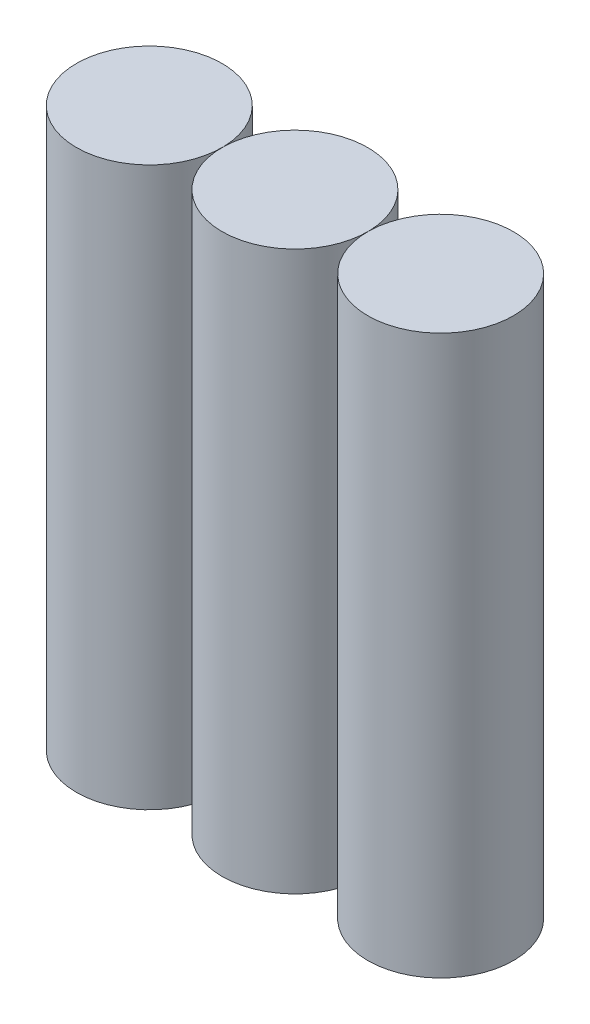
ISO-10303-21;
HEADER;
FILE_DESCRIPTION(('STEP AP214'),'2;1');
FILE_NAME('part.step','',(''),(''),'','','');
FILE_SCHEMA(('AUTOMOTIVE_DESIGN { 1 0 10303 214 1 1 1 1 }'));
ENDSEC;
DATA;
#1=APPLICATION_CONTEXT('core data for automotive mechanical design processes');
#2=APPLICATION_PROTOCOL_DEFINITION('international standard','automotive_design',2000,#1);
#3=PRODUCT_CONTEXT('',#1,'mechanical');
#4=PRODUCT('Part','Part','',(#3));
#5=PRODUCT_RELATED_PRODUCT_CATEGORY('part','',(#4));
#6=PRODUCT_DEFINITION_FORMATION('','',#4);
#7=PRODUCT_DEFINITION_CONTEXT('part definition',#1,'design');
#8=PRODUCT_DEFINITION('design','',#6,#7);
#9=PRODUCT_DEFINITION_SHAPE('','',#8);
#10=(LENGTH_UNIT() NAMED_UNIT(*) SI_UNIT(.MILLI.,.METRE.));
#11=(NAMED_UNIT(*) PLANE_ANGLE_UNIT() SI_UNIT($,.RADIAN.));
#12=(NAMED_UNIT(*) SI_UNIT($,.STERADIAN.) SOLID_ANGLE_UNIT());
#13=UNCERTAINTY_MEASURE_WITH_UNIT(LENGTH_MEASURE(1.E-05),#10,'distance_accuracy_value','');
#14=(GEOMETRIC_REPRESENTATION_CONTEXT(3) GLOBAL_UNCERTAINTY_ASSIGNED_CONTEXT((#13)) GLOBAL_UNIT_ASSIGNED_CONTEXT((#10,
#11,#12)) REPRESENTATION_CONTEXT('',''));
#15=CARTESIAN_POINT('',(0.,0.,0.));
#16=DIRECTION('',(0.,0.,1.));
#17=DIRECTION('',(1.,0.,0.));
#18=AXIS2_PLACEMENT_3D('',#15,#16,#17);
#19=CARTESIAN_POINT('',(18.,34.5,0.));
#20=DIRECTION('',(0.,-1.,0.));
#21=DIRECTION('',(0.,0.,-1.));
#22=AXIS2_PLACEMENT_3D('',#19,#20,#21);
#23=CYLINDRICAL_SURFACE('',#22,9.00000000000001);
#24=CARTESIAN_POINT('',(18.,34.5,0.));
#25=DIRECTION('',(0.,1.,0.));
#26=DIRECTION('',(0.,0.,1.));
#27=AXIS2_PLACEMENT_3D('',#24,#25,#26);
#28=CIRCLE('',#27,9.00000000000001);
#29=CARTESIAN_POINT('',(18.,34.5,9.00000000000001));
#30=VERTEX_POINT('',#29);
#31=EDGE_CURVE('E12',#30,#30,#28,.T.);
#32=ORIENTED_EDGE('',*,*,#31,.F.);
#33=EDGE_LOOP('',(#32));
#34=FACE_BOUND('',#33,.T.);
#35=CARTESIAN_POINT('',(18.,-34.5,0.));
#36=DIRECTION('',(0.,1.,0.));
#37=DIRECTION('',(0.,0.,1.));
#38=AXIS2_PLACEMENT_3D('',#35,#36,#37);
#39=CIRCLE('',#38,9.00000000000001);
#40=CARTESIAN_POINT('',(18.,-34.5,9.00000000000001));
#41=VERTEX_POINT('',#40);
#42=EDGE_CURVE('E55',#41,#41,#39,.T.);
#43=ORIENTED_EDGE('',*,*,#42,.T.);
#44=EDGE_LOOP('',(#43));
#45=FACE_BOUND('',#44,.T.);
#46=ADVANCED_FACE('F52',(#34,#45),#23,.T.);
#47=CARTESIAN_POINT('',(0.,34.5,0.));
#48=DIRECTION('',(0.,1.,0.));
#49=DIRECTION('',(0.,0.,1.));
#50=AXIS2_PLACEMENT_3D('',#47,#48,#49);
#51=PLANE('',#50);
#52=ORIENTED_EDGE('',*,*,#31,.T.);
#53=EDGE_LOOP('',(#52));
#54=FACE_BOUND('',#53,.T.);
#55=ADVANCED_FACE('F67',(#54),#51,.T.);
#56=CARTESIAN_POINT('',(0.,-34.5,0.));
#57=DIRECTION('',(0.,1.,0.));
#58=DIRECTION('',(0.,0.,1.));
#59=AXIS2_PLACEMENT_3D('',#56,#57,#58);
#60=PLANE('',#59);
#61=ORIENTED_EDGE('',*,*,#42,.F.);
#62=EDGE_LOOP('',(#61));
#63=FACE_BOUND('',#62,.T.);
#64=ADVANCED_FACE('F65',(#63),#60,.F.);
#65=CLOSED_SHELL('',(#46,#55,#64));
#66=MANIFOLD_SOLID_BREP('B2',#65);
#67=CARTESIAN_POINT('',(0.,34.5,0.));
#68=DIRECTION('',(0.,-1.,0.));
#69=DIRECTION('',(0.,0.,-1.));
#70=AXIS2_PLACEMENT_3D('',#67,#68,#69);
#71=CYLINDRICAL_SURFACE('',#70,9.);
#72=CARTESIAN_POINT('',(0.,34.5,0.));
#73=DIRECTION('',(0.,1.,0.));
#74=DIRECTION('',(0.,0.,1.));
#75=AXIS2_PLACEMENT_3D('',#72,#73,#74);
#76=CIRCLE('',#75,9.);
#77=CARTESIAN_POINT('',(0.,34.5,9.));
#78=VERTEX_POINT('',#77);
#79=EDGE_CURVE('E51',#78,#78,#76,.T.);
#80=ORIENTED_EDGE('',*,*,#79,.F.);
#81=EDGE_LOOP('',(#80));
#82=FACE_BOUND('',#81,.T.);
#83=CARTESIAN_POINT('',(0.,-34.5,0.));
#84=DIRECTION('',(0.,1.,0.));
#85=DIRECTION('',(0.,0.,1.));
#86=AXIS2_PLACEMENT_3D('',#83,#84,#85);
#87=CIRCLE('',#86,9.);
#88=CARTESIAN_POINT('',(0.,-34.5,9.));
#89=VERTEX_POINT('',#88);
#90=EDGE_CURVE('E103',#89,#89,#87,.T.);
#91=ORIENTED_EDGE('',*,*,#90,.T.);
#92=EDGE_LOOP('',(#91));
#93=FACE_BOUND('',#92,.T.);
#94=ADVANCED_FACE('F100',(#82,#93),#71,.T.);
#95=CARTESIAN_POINT('',(0.,34.5,0.));
#96=DIRECTION('',(0.,1.,0.));
#97=DIRECTION('',(0.,0.,1.));
#98=AXIS2_PLACEMENT_3D('',#95,#96,#97);
#99=PLANE('',#98);
#100=ORIENTED_EDGE('',*,*,#79,.T.);
#101=EDGE_LOOP('',(#100));
#102=FACE_BOUND('',#101,.T.);
#103=ADVANCED_FACE('F115',(#102),#99,.T.);
#104=CARTESIAN_POINT('',(0.,-34.5,0.));
#105=DIRECTION('',(0.,1.,0.));
#106=DIRECTION('',(0.,0.,1.));
#107=AXIS2_PLACEMENT_3D('',#104,#105,#106);
#108=PLANE('',#107);
#109=ORIENTED_EDGE('',*,*,#90,.F.);
#110=EDGE_LOOP('',(#109));
#111=FACE_BOUND('',#110,.T.);
#112=ADVANCED_FACE('F113',(#111),#108,.F.);
#113=CLOSED_SHELL('',(#94,#103,#112));
#114=MANIFOLD_SOLID_BREP('B7',#113);
#115=CARTESIAN_POINT('',(-18.,34.5,0.));
#116=DIRECTION('',(0.,-1.,0.));
#117=DIRECTION('',(0.,0.,-1.));
#118=AXIS2_PLACEMENT_3D('',#115,#116,#117);
#119=CYLINDRICAL_SURFACE('',#118,9.);
#120=CARTESIAN_POINT('',(-18.,34.5,0.));
#121=DIRECTION('',(0.,1.,0.));
#122=DIRECTION('',(0.,0.,1.));
#123=AXIS2_PLACEMENT_3D('',#120,#121,#122);
#124=CIRCLE('',#123,9.);
#125=CARTESIAN_POINT('',(-18.,34.5,9.));
#126=VERTEX_POINT('',#125);
#127=EDGE_CURVE('E99',#126,#126,#124,.T.);
#128=ORIENTED_EDGE('',*,*,#127,.F.);
#129=EDGE_LOOP('',(#128));
#130=FACE_BOUND('',#129,.T.);
#131=CARTESIAN_POINT('',(-18.,-34.5,0.));
#132=DIRECTION('',(0.,1.,0.));
#133=DIRECTION('',(0.,0.,1.));
#134=AXIS2_PLACEMENT_3D('',#131,#132,#133);
#135=CIRCLE('',#134,9.);
#136=CARTESIAN_POINT('',(-18.,-34.5,9.));
#137=VERTEX_POINT('',#136);
#138=EDGE_CURVE('E144',#137,#137,#135,.T.);
#139=ORIENTED_EDGE('',*,*,#138,.T.);
#140=EDGE_LOOP('',(#139));
#141=FACE_BOUND('',#140,.T.);
#142=ADVANCED_FACE('F141',(#130,#141),#119,.T.);
#143=CARTESIAN_POINT('',(0.,34.5,0.));
#144=DIRECTION('',(0.,1.,0.));
#145=DIRECTION('',(0.,0.,1.));
#146=AXIS2_PLACEMENT_3D('',#143,#144,#145);
#147=PLANE('',#146);
#148=ORIENTED_EDGE('',*,*,#127,.T.);
#149=EDGE_LOOP('',(#148));
#150=FACE_BOUND('',#149,.T.);
#151=ADVANCED_FACE('F156',(#150),#147,.T.);
#152=CARTESIAN_POINT('',(0.,-34.5,0.));
#153=DIRECTION('',(0.,1.,0.));
#154=DIRECTION('',(0.,0.,1.));
#155=AXIS2_PLACEMENT_3D('',#152,#153,#154);
#156=PLANE('',#155);
#157=ORIENTED_EDGE('',*,*,#138,.F.);
#158=EDGE_LOOP('',(#157));
#159=FACE_BOUND('',#158,.T.);
#160=ADVANCED_FACE('F154',(#159),#156,.F.);
#161=CLOSED_SHELL('',(#142,#151,#160));
#162=MANIFOLD_SOLID_BREP('B46',#161);
#163=ADVANCED_BREP_SHAPE_REPRESENTATION('',(#18,#66,#114,#162),#14);
#164=SHAPE_DEFINITION_REPRESENTATION(#9,#163);
ENDSEC;
END-ISO-10303-21;
